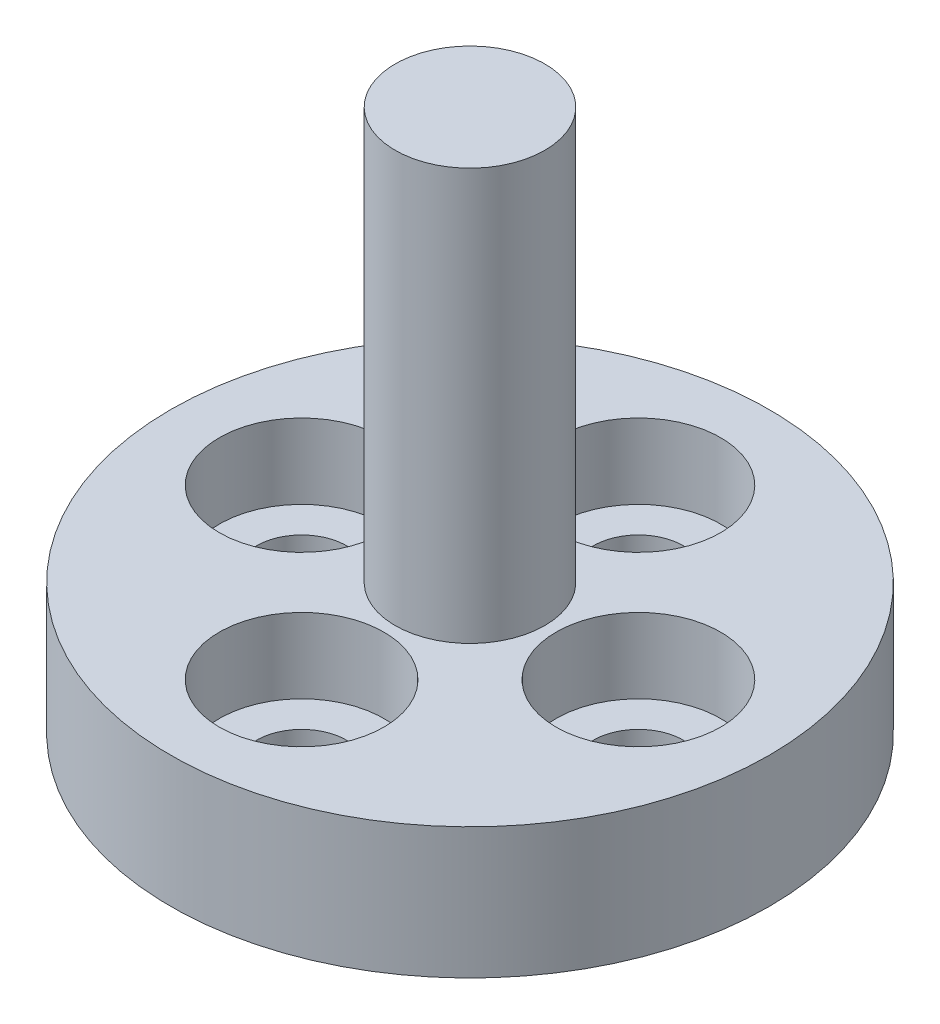
ISO-10303-21;
HEADER;
FILE_DESCRIPTION(('STEP AP214'),'2;1');
FILE_NAME('part.step','',(''),(''),'','','');
FILE_SCHEMA(('AUTOMOTIVE_DESIGN { 1 0 10303 214 1 1 1 1 }'));
ENDSEC;
DATA;
#1=APPLICATION_CONTEXT('core data for automotive mechanical design processes');
#2=APPLICATION_PROTOCOL_DEFINITION('international standard','automotive_design',2000,#1);
#3=PRODUCT_CONTEXT('',#1,'mechanical');
#4=PRODUCT('Part','Part','',(#3));
#5=PRODUCT_RELATED_PRODUCT_CATEGORY('part','',(#4));
#6=PRODUCT_DEFINITION_FORMATION('','',#4);
#7=PRODUCT_DEFINITION_CONTEXT('part definition',#1,'design');
#8=PRODUCT_DEFINITION('design','',#6,#7);
#9=PRODUCT_DEFINITION_SHAPE('','',#8);
#10=(LENGTH_UNIT() NAMED_UNIT(*) SI_UNIT(.MILLI.,.METRE.));
#11=(NAMED_UNIT(*) PLANE_ANGLE_UNIT() SI_UNIT($,.RADIAN.));
#12=(NAMED_UNIT(*) SI_UNIT($,.STERADIAN.) SOLID_ANGLE_UNIT());
#13=UNCERTAINTY_MEASURE_WITH_UNIT(LENGTH_MEASURE(1.E-05),#10,'distance_accuracy_value','');
#14=(GEOMETRIC_REPRESENTATION_CONTEXT(3) GLOBAL_UNCERTAINTY_ASSIGNED_CONTEXT((#13)) GLOBAL_UNIT_ASSIGNED_CONTEXT((#10,
#11,#12)) REPRESENTATION_CONTEXT('',''));
#15=CARTESIAN_POINT('',(0.,0.,0.));
#16=DIRECTION('',(0.,0.,1.));
#17=DIRECTION('',(1.,0.,0.));
#18=AXIS2_PLACEMENT_3D('',#15,#16,#17);
#19=CARTESIAN_POINT('',(-4.,7.25,0.));
#20=DIRECTION('',(0.,1.,0.));
#21=DIRECTION('',(-1.,0.,0.));
#22=AXIS2_PLACEMENT_3D('',#19,#20,#21);
#23=PLANE('',#22);
#24=CARTESIAN_POINT('',(-4.,7.25,0.));
#25=DIRECTION('',(0.,-1.,0.));
#26=DIRECTION('',(1.,0.,0.));
#27=AXIS2_PLACEMENT_3D('',#24,#25,#26);
#28=CIRCLE('',#27,2.);
#29=CARTESIAN_POINT('',(-2.,7.25,0.));
#30=VERTEX_POINT('',#29);
#31=EDGE_CURVE('E10',#30,#30,#28,.T.);
#32=ORIENTED_EDGE('',*,*,#31,.F.);
#33=EDGE_LOOP('',(#32));
#34=FACE_BOUND('',#33,.T.);
#35=ADVANCED_FACE('F37',(#34),#23,.T.);
#36=CARTESIAN_POINT('',(-4.,-7.25,0.));
#37=DIRECTION('',(0.,-1.,0.));
#38=DIRECTION('',(1.,0.,0.));
#39=AXIS2_PLACEMENT_3D('',#36,#37,#38);
#40=CYLINDRICAL_SURFACE('',#39,2.);
#41=ORIENTED_EDGE('',*,*,#31,.T.);
#42=EDGE_LOOP('',(#41));
#43=FACE_BOUND('',#42,.T.);
#44=CARTESIAN_POINT('',(-4.,-3.75,0.));
#45=DIRECTION('',(0.,-1.,0.));
#46=DIRECTION('',(1.,0.,0.));
#47=AXIS2_PLACEMENT_3D('',#44,#45,#46);
#48=CIRCLE('',#47,2.);
#49=CARTESIAN_POINT('',(-2.,-3.75,0.));
#50=VERTEX_POINT('',#49);
#51=EDGE_CURVE('E44',#50,#50,#48,.T.);
#52=ORIENTED_EDGE('',*,*,#51,.F.);
#53=EDGE_LOOP('',(#52));
#54=FACE_BOUND('',#53,.T.);
#55=ADVANCED_FACE('F131',(#43,#54),#40,.T.);
#56=CARTESIAN_POINT('',(4.,-3.75,0.));
#57=DIRECTION('',(0.,1.,0.));
#58=DIRECTION('',(-1.,0.,0.));
#59=AXIS2_PLACEMENT_3D('',#56,#57,#58);
#60=PLANE('',#59);
#61=CARTESIAN_POINT('',(-4.00000000000002,-3.75,-4.5));
#62=DIRECTION('',(0.,1.,0.));
#63=DIRECTION('',(0.,0.,1.));
#64=AXIS2_PLACEMENT_3D('',#61,#62,#63);
#65=CIRCLE('',#64,2.19999999999999);
#66=CARTESIAN_POINT('',(-4.00000000000002,-3.75,-2.30000000000001));
#67=VERTEX_POINT('',#66);
#68=EDGE_CURVE('E120',#67,#67,#65,.T.);
#69=ORIENTED_EDGE('',*,*,#68,.F.);
#70=EDGE_LOOP('',(#69));
#71=FACE_BOUND('',#70,.T.);
#72=CARTESIAN_POINT('',(0.5,-3.75,0.));
#73=DIRECTION('',(0.,1.,0.));
#74=DIRECTION('',(0.,0.,1.));
#75=AXIS2_PLACEMENT_3D('',#72,#73,#74);
#76=CIRCLE('',#75,2.19999999999999);
#77=CARTESIAN_POINT('',(0.5,-3.75,2.19999999999999));
#78=VERTEX_POINT('',#77);
#79=EDGE_CURVE('E104',#78,#78,#76,.T.);
#80=ORIENTED_EDGE('',*,*,#79,.F.);
#81=EDGE_LOOP('',(#80));
#82=FACE_BOUND('',#81,.T.);
#83=CARTESIAN_POINT('',(-3.99999999999998,-3.75,4.5));
#84=DIRECTION('',(0.,1.,0.));
#85=DIRECTION('',(0.,0.,1.));
#86=AXIS2_PLACEMENT_3D('',#83,#84,#85);
#87=CIRCLE('',#86,2.19999999999999);
#88=CARTESIAN_POINT('',(-3.99999999999998,-3.75,6.69999999999999));
#89=VERTEX_POINT('',#88);
#90=EDGE_CURVE('E88',#89,#89,#87,.T.);
#91=ORIENTED_EDGE('',*,*,#90,.F.);
#92=EDGE_LOOP('',(#91));
#93=FACE_BOUND('',#92,.T.);
#94=CARTESIAN_POINT('',(-8.5,-3.75,0.));
#95=DIRECTION('',(0.,1.,0.));
#96=DIRECTION('',(0.,0.,1.));
#97=AXIS2_PLACEMENT_3D('',#94,#95,#96);
#98=CIRCLE('',#97,2.19999999999999);
#99=CARTESIAN_POINT('',(-8.5,-3.75,2.19999999999999));
#100=VERTEX_POINT('',#99);
#101=EDGE_CURVE('E72',#100,#100,#98,.T.);
#102=ORIENTED_EDGE('',*,*,#101,.F.);
#103=EDGE_LOOP('',(#102));
#104=FACE_BOUND('',#103,.T.);
#105=ORIENTED_EDGE('',*,*,#51,.T.);
#106=EDGE_LOOP('',(#105));
#107=FACE_BOUND('',#106,.T.);
#108=CARTESIAN_POINT('',(-4.,-3.75,0.));
#109=DIRECTION('',(0.,-1.,0.));
#110=DIRECTION('',(1.,0.,0.));
#111=AXIS2_PLACEMENT_3D('',#108,#109,#110);
#112=CIRCLE('',#111,8.);
#113=CARTESIAN_POINT('',(4.,-3.75,0.));
#114=VERTEX_POINT('',#113);
#115=EDGE_CURVE('E49',#114,#114,#112,.T.);
#116=ORIENTED_EDGE('',*,*,#115,.F.);
#117=EDGE_LOOP('',(#116));
#118=FACE_BOUND('',#117,.T.);
#119=ADVANCED_FACE('F127',(#71,#82,#93,#104,#107,#118),#60,.T.);
#120=CARTESIAN_POINT('',(-4.,-7.25,0.));
#121=DIRECTION('',(0.,-1.,0.));
#122=DIRECTION('',(1.,0.,0.));
#123=AXIS2_PLACEMENT_3D('',#120,#121,#122);
#124=CYLINDRICAL_SURFACE('',#123,8.);
#125=ORIENTED_EDGE('',*,*,#115,.T.);
#126=EDGE_LOOP('',(#125));
#127=FACE_BOUND('',#126,.T.);
#128=CARTESIAN_POINT('',(-4.,-7.25,0.));
#129=DIRECTION('',(0.,-1.,0.));
#130=DIRECTION('',(1.,0.,0.));
#131=AXIS2_PLACEMENT_3D('',#128,#129,#130);
#132=CIRCLE('',#131,8.);
#133=CARTESIAN_POINT('',(4.,-7.25,0.));
#134=VERTEX_POINT('',#133);
#135=EDGE_CURVE('E54',#134,#134,#132,.T.);
#136=ORIENTED_EDGE('',*,*,#135,.F.);
#137=EDGE_LOOP('',(#136));
#138=FACE_BOUND('',#137,.T.);
#139=ADVANCED_FACE('F130',(#127,#138),#124,.T.);
#140=CARTESIAN_POINT('',(-4.,-7.25,0.));
#141=DIRECTION('',(0.,-1.,0.));
#142=DIRECTION('',(1.,0.,0.));
#143=AXIS2_PLACEMENT_3D('',#140,#141,#142);
#144=PLANE('',#143);
#145=CARTESIAN_POINT('',(-4.00000000000002,-7.25,-4.5));
#146=DIRECTION('',(0.,1.,0.));
#147=DIRECTION('',(0.,0.,1.));
#148=AXIS2_PLACEMENT_3D('',#145,#146,#147);
#149=CIRCLE('',#148,1.2);
#150=CARTESIAN_POINT('',(-4.00000000000002,-7.25,-3.3));
#151=VERTEX_POINT('',#150);
#152=EDGE_CURVE('E108',#151,#151,#149,.T.);
#153=ORIENTED_EDGE('',*,*,#152,.T.);
#154=EDGE_LOOP('',(#153));
#155=FACE_BOUND('',#154,.T.);
#156=CARTESIAN_POINT('',(0.5,-7.25,0.));
#157=DIRECTION('',(0.,1.,0.));
#158=DIRECTION('',(0.,0.,1.));
#159=AXIS2_PLACEMENT_3D('',#156,#157,#158);
#160=CIRCLE('',#159,1.2);
#161=CARTESIAN_POINT('',(0.5,-7.25,1.2));
#162=VERTEX_POINT('',#161);
#163=EDGE_CURVE('E92',#162,#162,#160,.T.);
#164=ORIENTED_EDGE('',*,*,#163,.T.);
#165=EDGE_LOOP('',(#164));
#166=FACE_BOUND('',#165,.T.);
#167=CARTESIAN_POINT('',(-3.99999999999998,-7.25,4.5));
#168=DIRECTION('',(0.,1.,0.));
#169=DIRECTION('',(0.,0.,1.));
#170=AXIS2_PLACEMENT_3D('',#167,#168,#169);
#171=CIRCLE('',#170,1.2);
#172=CARTESIAN_POINT('',(-3.99999999999998,-7.25,5.7));
#173=VERTEX_POINT('',#172);
#174=EDGE_CURVE('E76',#173,#173,#171,.T.);
#175=ORIENTED_EDGE('',*,*,#174,.T.);
#176=EDGE_LOOP('',(#175));
#177=FACE_BOUND('',#176,.T.);
#178=CARTESIAN_POINT('',(-8.5,-7.25,0.));
#179=DIRECTION('',(0.,1.,0.));
#180=DIRECTION('',(0.,0.,1.));
#181=AXIS2_PLACEMENT_3D('',#178,#179,#180);
#182=CIRCLE('',#181,1.2);
#183=CARTESIAN_POINT('',(-8.5,-7.25,1.2));
#184=VERTEX_POINT('',#183);
#185=EDGE_CURVE('E60',#184,#184,#182,.T.);
#186=ORIENTED_EDGE('',*,*,#185,.T.);
#187=EDGE_LOOP('',(#186));
#188=FACE_BOUND('',#187,.T.);
#189=ORIENTED_EDGE('',*,*,#135,.T.);
#190=EDGE_LOOP('',(#189));
#191=FACE_BOUND('',#190,.T.);
#192=ADVANCED_FACE('F143',(#155,#166,#177,#188,#191),#144,.T.);
#193=CARTESIAN_POINT('',(-8.5,-3.75,0.));
#194=DIRECTION('',(0.,1.,0.));
#195=DIRECTION('',(0.,0.,1.));
#196=AXIS2_PLACEMENT_3D('',#193,#194,#195);
#197=CYLINDRICAL_SURFACE('',#196,1.20000000000001);
#198=ORIENTED_EDGE('',*,*,#185,.F.);
#199=EDGE_LOOP('',(#198));
#200=FACE_BOUND('',#199,.T.);
#201=CARTESIAN_POINT('',(-8.5,-5.75,0.));
#202=DIRECTION('',(0.,1.,0.));
#203=DIRECTION('',(0.,0.,1.));
#204=AXIS2_PLACEMENT_3D('',#201,#202,#203);
#205=CIRCLE('',#204,1.20000000000001);
#206=CARTESIAN_POINT('',(-8.5,-5.75,1.20000000000001));
#207=VERTEX_POINT('',#206);
#208=EDGE_CURVE('E64',#207,#207,#205,.T.);
#209=ORIENTED_EDGE('',*,*,#208,.T.);
#210=EDGE_LOOP('',(#209));
#211=FACE_BOUND('',#210,.T.);
#212=ADVANCED_FACE('F148',(#200,#211),#197,.F.);
#213=CARTESIAN_POINT('',(-7.29999999999999,-5.75,0.));
#214=DIRECTION('',(0.,-1.,0.));
#215=DIRECTION('',(0.,0.,-1.));
#216=AXIS2_PLACEMENT_3D('',#213,#214,#215);
#217=PLANE('',#216);
#218=ORIENTED_EDGE('',*,*,#208,.F.);
#219=EDGE_LOOP('',(#218));
#220=FACE_BOUND('',#219,.T.);
#221=CARTESIAN_POINT('',(-8.5,-5.75,0.));
#222=DIRECTION('',(0.,1.,0.));
#223=DIRECTION('',(0.,0.,1.));
#224=AXIS2_PLACEMENT_3D('',#221,#222,#223);
#225=CIRCLE('',#224,2.19999999999999);
#226=CARTESIAN_POINT('',(-8.5,-5.75,2.19999999999999));
#227=VERTEX_POINT('',#226);
#228=EDGE_CURVE('E68',#227,#227,#225,.T.);
#229=ORIENTED_EDGE('',*,*,#228,.T.);
#230=EDGE_LOOP('',(#229));
#231=FACE_BOUND('',#230,.T.);
#232=ADVANCED_FACE('F154',(#220,#231),#217,.F.);
#233=CARTESIAN_POINT('',(-8.5,-3.75,0.));
#234=DIRECTION('',(0.,1.,0.));
#235=DIRECTION('',(0.,0.,1.));
#236=AXIS2_PLACEMENT_3D('',#233,#234,#235);
#237=CYLINDRICAL_SURFACE('',#236,2.19999999999999);
#238=ORIENTED_EDGE('',*,*,#228,.F.);
#239=EDGE_LOOP('',(#238));
#240=FACE_BOUND('',#239,.T.);
#241=ORIENTED_EDGE('',*,*,#101,.T.);
#242=EDGE_LOOP('',(#241));
#243=FACE_BOUND('',#242,.T.);
#244=ADVANCED_FACE('F195',(#240,#243),#237,.F.);
#245=CARTESIAN_POINT('',(-3.99999999999998,-3.75,4.5));
#246=DIRECTION('',(0.,1.,0.));
#247=DIRECTION('',(0.,0.,1.));
#248=AXIS2_PLACEMENT_3D('',#245,#246,#247);
#249=CYLINDRICAL_SURFACE('',#248,1.20000000000001);
#250=ORIENTED_EDGE('',*,*,#174,.F.);
#251=EDGE_LOOP('',(#250));
#252=FACE_BOUND('',#251,.T.);
#253=CARTESIAN_POINT('',(-3.99999999999998,-5.75,4.5));
#254=DIRECTION('',(0.,1.,0.));
#255=DIRECTION('',(0.,0.,1.));
#256=AXIS2_PLACEMENT_3D('',#253,#254,#255);
#257=CIRCLE('',#256,1.20000000000001);
#258=CARTESIAN_POINT('',(-3.99999999999998,-5.75,5.70000000000001));
#259=VERTEX_POINT('',#258);
#260=EDGE_CURVE('E80',#259,#259,#257,.T.);
#261=ORIENTED_EDGE('',*,*,#260,.T.);
#262=EDGE_LOOP('',(#261));
#263=FACE_BOUND('',#262,.T.);
#264=ADVANCED_FACE('F204',(#252,#263),#249,.F.);
#265=CARTESIAN_POINT('',(-2.79999999999997,-5.75,4.5));
#266=DIRECTION('',(0.,-1.,0.));
#267=DIRECTION('',(0.,0.,-1.));
#268=AXIS2_PLACEMENT_3D('',#265,#266,#267);
#269=PLANE('',#268);
#270=ORIENTED_EDGE('',*,*,#260,.F.);
#271=EDGE_LOOP('',(#270));
#272=FACE_BOUND('',#271,.T.);
#273=CARTESIAN_POINT('',(-3.99999999999998,-5.75,4.5));
#274=DIRECTION('',(0.,1.,0.));
#275=DIRECTION('',(0.,0.,1.));
#276=AXIS2_PLACEMENT_3D('',#273,#274,#275);
#277=CIRCLE('',#276,2.19999999999999);
#278=CARTESIAN_POINT('',(-3.99999999999998,-5.75,6.69999999999999));
#279=VERTEX_POINT('',#278);
#280=EDGE_CURVE('E84',#279,#279,#277,.T.);
#281=ORIENTED_EDGE('',*,*,#280,.T.);
#282=EDGE_LOOP('',(#281));
#283=FACE_BOUND('',#282,.T.);
#284=ADVANCED_FACE('F213',(#272,#283),#269,.F.);
#285=CARTESIAN_POINT('',(-3.99999999999998,-3.75,4.5));
#286=DIRECTION('',(0.,1.,0.));
#287=DIRECTION('',(0.,0.,1.));
#288=AXIS2_PLACEMENT_3D('',#285,#286,#287);
#289=CYLINDRICAL_SURFACE('',#288,2.19999999999999);
#290=ORIENTED_EDGE('',*,*,#280,.F.);
#291=EDGE_LOOP('',(#290));
#292=FACE_BOUND('',#291,.T.);
#293=ORIENTED_EDGE('',*,*,#90,.T.);
#294=EDGE_LOOP('',(#293));
#295=FACE_BOUND('',#294,.T.);
#296=ADVANCED_FACE('F222',(#292,#295),#289,.F.);
#297=CARTESIAN_POINT('',(0.5,-3.75,0.));
#298=DIRECTION('',(0.,1.,0.));
#299=DIRECTION('',(0.,0.,1.));
#300=AXIS2_PLACEMENT_3D('',#297,#298,#299);
#301=CYLINDRICAL_SURFACE('',#300,1.20000000000001);
#302=ORIENTED_EDGE('',*,*,#163,.F.);
#303=EDGE_LOOP('',(#302));
#304=FACE_BOUND('',#303,.T.);
#305=CARTESIAN_POINT('',(0.5,-5.75,0.));
#306=DIRECTION('',(0.,1.,0.));
#307=DIRECTION('',(0.,0.,1.));
#308=AXIS2_PLACEMENT_3D('',#305,#306,#307);
#309=CIRCLE('',#308,1.20000000000001);
#310=CARTESIAN_POINT('',(0.5,-5.75,1.20000000000001));
#311=VERTEX_POINT('',#310);
#312=EDGE_CURVE('E96',#311,#311,#309,.T.);
#313=ORIENTED_EDGE('',*,*,#312,.T.);
#314=EDGE_LOOP('',(#313));
#315=FACE_BOUND('',#314,.T.);
#316=ADVANCED_FACE('F231',(#304,#315),#301,.F.);
#317=CARTESIAN_POINT('',(1.70000000000001,-5.75,0.));
#318=DIRECTION('',(0.,-1.,0.));
#319=DIRECTION('',(0.,0.,-1.));
#320=AXIS2_PLACEMENT_3D('',#317,#318,#319);
#321=PLANE('',#320);
#322=ORIENTED_EDGE('',*,*,#312,.F.);
#323=EDGE_LOOP('',(#322));
#324=FACE_BOUND('',#323,.T.);
#325=CARTESIAN_POINT('',(0.5,-5.75,0.));
#326=DIRECTION('',(0.,1.,0.));
#327=DIRECTION('',(0.,0.,1.));
#328=AXIS2_PLACEMENT_3D('',#325,#326,#327);
#329=CIRCLE('',#328,2.19999999999999);
#330=CARTESIAN_POINT('',(0.5,-5.75,2.19999999999999));
#331=VERTEX_POINT('',#330);
#332=EDGE_CURVE('E100',#331,#331,#329,.T.);
#333=ORIENTED_EDGE('',*,*,#332,.T.);
#334=EDGE_LOOP('',(#333));
#335=FACE_BOUND('',#334,.T.);
#336=ADVANCED_FACE('F240',(#324,#335),#321,.F.);
#337=CARTESIAN_POINT('',(0.5,-3.75,0.));
#338=DIRECTION('',(0.,1.,0.));
#339=DIRECTION('',(0.,0.,1.));
#340=AXIS2_PLACEMENT_3D('',#337,#338,#339);
#341=CYLINDRICAL_SURFACE('',#340,2.19999999999999);
#342=ORIENTED_EDGE('',*,*,#332,.F.);
#343=EDGE_LOOP('',(#342));
#344=FACE_BOUND('',#343,.T.);
#345=ORIENTED_EDGE('',*,*,#79,.T.);
#346=EDGE_LOOP('',(#345));
#347=FACE_BOUND('',#346,.T.);
#348=ADVANCED_FACE('F249',(#344,#347),#341,.F.);
#349=CARTESIAN_POINT('',(-4.00000000000002,-3.75,-4.5));
#350=DIRECTION('',(0.,1.,0.));
#351=DIRECTION('',(0.,0.,1.));
#352=AXIS2_PLACEMENT_3D('',#349,#350,#351);
#353=CYLINDRICAL_SURFACE('',#352,1.20000000000001);
#354=ORIENTED_EDGE('',*,*,#152,.F.);
#355=EDGE_LOOP('',(#354));
#356=FACE_BOUND('',#355,.T.);
#357=CARTESIAN_POINT('',(-4.00000000000002,-5.75,-4.5));
#358=DIRECTION('',(0.,1.,0.));
#359=DIRECTION('',(0.,0.,1.));
#360=AXIS2_PLACEMENT_3D('',#357,#358,#359);
#361=CIRCLE('',#360,1.20000000000001);
#362=CARTESIAN_POINT('',(-4.00000000000002,-5.75,-3.29999999999999));
#363=VERTEX_POINT('',#362);
#364=EDGE_CURVE('E112',#363,#363,#361,.T.);
#365=ORIENTED_EDGE('',*,*,#364,.T.);
#366=EDGE_LOOP('',(#365));
#367=FACE_BOUND('',#366,.T.);
#368=ADVANCED_FACE('F258',(#356,#367),#353,.F.);
#369=CARTESIAN_POINT('',(-2.8,-5.75,-4.5));
#370=DIRECTION('',(0.,-1.,0.));
#371=DIRECTION('',(0.,0.,-1.));
#372=AXIS2_PLACEMENT_3D('',#369,#370,#371);
#373=PLANE('',#372);
#374=ORIENTED_EDGE('',*,*,#364,.F.);
#375=EDGE_LOOP('',(#374));
#376=FACE_BOUND('',#375,.T.);
#377=CARTESIAN_POINT('',(-4.00000000000002,-5.75,-4.5));
#378=DIRECTION('',(0.,1.,0.));
#379=DIRECTION('',(0.,0.,1.));
#380=AXIS2_PLACEMENT_3D('',#377,#378,#379);
#381=CIRCLE('',#380,2.19999999999999);
#382=CARTESIAN_POINT('',(-4.00000000000002,-5.75,-2.30000000000001));
#383=VERTEX_POINT('',#382);
#384=EDGE_CURVE('E116',#383,#383,#381,.T.);
#385=ORIENTED_EDGE('',*,*,#384,.T.);
#386=EDGE_LOOP('',(#385));
#387=FACE_BOUND('',#386,.T.);
#388=ADVANCED_FACE('F267',(#376,#387),#373,.F.);
#389=CARTESIAN_POINT('',(-4.00000000000002,-3.75,-4.5));
#390=DIRECTION('',(0.,1.,0.));
#391=DIRECTION('',(0.,0.,1.));
#392=AXIS2_PLACEMENT_3D('',#389,#390,#391);
#393=CYLINDRICAL_SURFACE('',#392,2.19999999999999);
#394=ORIENTED_EDGE('',*,*,#384,.F.);
#395=EDGE_LOOP('',(#394));
#396=FACE_BOUND('',#395,.T.);
#397=ORIENTED_EDGE('',*,*,#68,.T.);
#398=EDGE_LOOP('',(#397));
#399=FACE_BOUND('',#398,.T.);
#400=ADVANCED_FACE('F125',(#396,#399),#393,.F.);
#401=CLOSED_SHELL('',(#35,#55,#119,#139,#192,#212,#232,#244,#264,#284,#296,#316,#336,#348,#368,
#388,#400));
#402=MANIFOLD_SOLID_BREP('B2',#401);
#403=ADVANCED_BREP_SHAPE_REPRESENTATION('',(#18,#402),#14);
#404=SHAPE_DEFINITION_REPRESENTATION(#9,#403);
ENDSEC;
END-ISO-10303-21;
